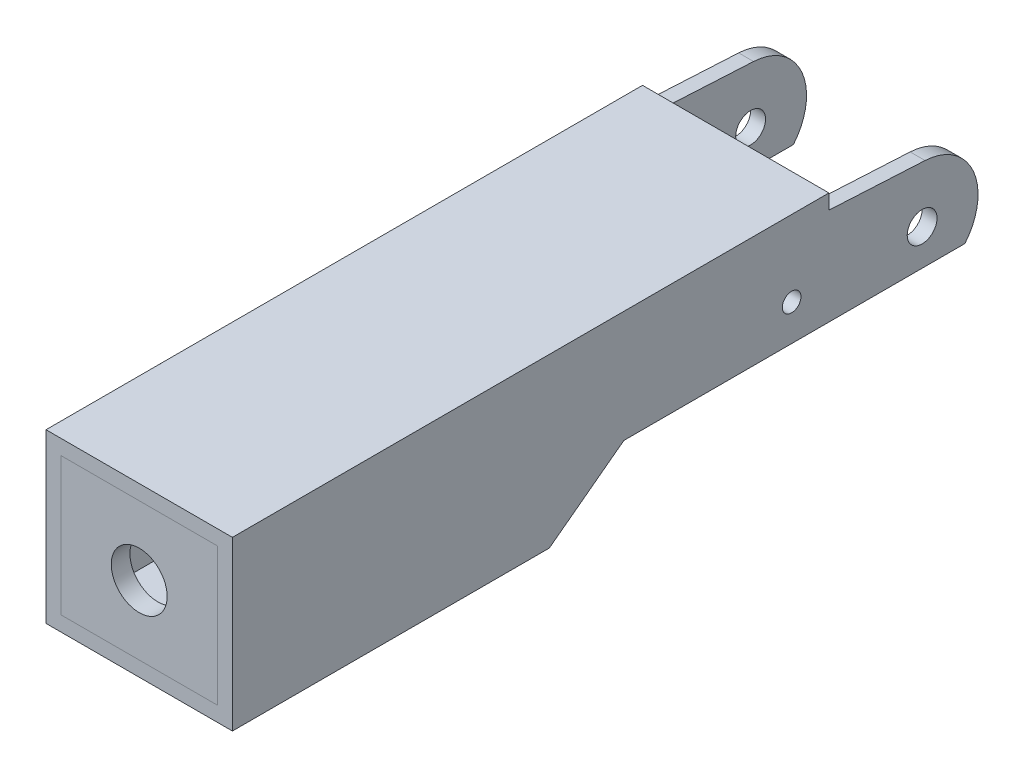
ISO-10303-21;
HEADER;
FILE_DESCRIPTION(('STEP AP214'),'2;1');
FILE_NAME('part.step','',(''),(''),'','','');
FILE_SCHEMA(('AUTOMOTIVE_DESIGN { 1 0 10303 214 1 1 1 1 }'));
ENDSEC;
DATA;
#1=APPLICATION_CONTEXT('core data for automotive mechanical design processes');
#2=APPLICATION_PROTOCOL_DEFINITION('international standard','automotive_design',2000,#1);
#3=PRODUCT_CONTEXT('',#1,'mechanical');
#4=PRODUCT('Part','Part','',(#3));
#5=PRODUCT_RELATED_PRODUCT_CATEGORY('part','',(#4));
#6=PRODUCT_DEFINITION_FORMATION('','',#4);
#7=PRODUCT_DEFINITION_CONTEXT('part definition',#1,'design');
#8=PRODUCT_DEFINITION('design','',#6,#7);
#9=PRODUCT_DEFINITION_SHAPE('','',#8);
#10=(LENGTH_UNIT() NAMED_UNIT(*) SI_UNIT(.MILLI.,.METRE.));
#11=(NAMED_UNIT(*) PLANE_ANGLE_UNIT() SI_UNIT($,.RADIAN.));
#12=(NAMED_UNIT(*) SI_UNIT($,.STERADIAN.) SOLID_ANGLE_UNIT());
#13=UNCERTAINTY_MEASURE_WITH_UNIT(LENGTH_MEASURE(1.E-05),#10,'distance_accuracy_value','');
#14=(GEOMETRIC_REPRESENTATION_CONTEXT(3) GLOBAL_UNCERTAINTY_ASSIGNED_CONTEXT((#13)) GLOBAL_UNIT_ASSIGNED_CONTEXT((#10,
#11,#12)) REPRESENTATION_CONTEXT('',''));
#15=CARTESIAN_POINT('',(0.,0.,0.));
#16=DIRECTION('',(0.,0.,1.));
#17=DIRECTION('',(1.,0.,0.));
#18=AXIS2_PLACEMENT_3D('',#15,#16,#17);
#19=CARTESIAN_POINT('',(4.,-4.,195.));
#20=DIRECTION('',(-1.,0.,0.));
#21=DIRECTION('',(0.,0.,1.));
#22=AXIS2_PLACEMENT_3D('',#19,#20,#21);
#23=PLANE('',#22);
#24=DIRECTION('',(0.,-1.,0.));
#25=VECTOR('',#24,1.);
#26=CARTESIAN_POINT('',(4.,-4.,200.));
#27=LINE('',#26,#25);
#28=CARTESIAN_POINT('',(4.,-4.,200.));
#29=VERTEX_POINT('',#28);
#30=CARTESIAN_POINT('',(4.,-41.,200.));
#31=VERTEX_POINT('',#30);
#32=EDGE_CURVE('E113',#29,#31,#27,.T.);
#33=ORIENTED_EDGE('',*,*,#32,.F.);
#34=DIRECTION('',(0.,0.,1.));
#35=VECTOR('',#34,1.);
#36=CARTESIAN_POINT('',(4.,-4.,195.));
#37=LINE('',#36,#35);
#38=CARTESIAN_POINT('',(4.,-4.,195.));
#39=VERTEX_POINT('',#38);
#40=EDGE_CURVE('E13',#39,#29,#37,.T.);
#41=ORIENTED_EDGE('',*,*,#40,.F.);
#42=DIRECTION('',(0.,-1.,0.));
#43=VECTOR('',#42,1.);
#44=CARTESIAN_POINT('',(4.,-4.,195.));
#45=LINE('',#44,#43);
#46=CARTESIAN_POINT('',(4.,-41.,195.));
#47=VERTEX_POINT('',#46);
#48=EDGE_CURVE('E106',#39,#47,#45,.T.);
#49=ORIENTED_EDGE('',*,*,#48,.T.);
#50=DIRECTION('',(0.,0.,1.));
#51=VECTOR('',#50,1.);
#52=CARTESIAN_POINT('',(4.,-41.,195.));
#53=LINE('',#52,#51);
#54=EDGE_CURVE('E51',#47,#31,#53,.T.);
#55=ORIENTED_EDGE('',*,*,#54,.T.);
#56=EDGE_LOOP('',(#33,#41,#49,#55));
#57=FACE_BOUND('',#56,.T.);
#58=ADVANCED_FACE('F48',(#57),#23,.T.);
#59=CARTESIAN_POINT('',(4.,-4.,195.));
#60=DIRECTION('',(0.,1.,0.));
#61=DIRECTION('',(0.,0.,1.));
#62=AXIS2_PLACEMENT_3D('',#59,#60,#61);
#63=PLANE('',#62);
#64=DIRECTION('',(-1.,0.,0.));
#65=VECTOR('',#64,1.);
#66=CARTESIAN_POINT('',(4.,-4.,200.));
#67=LINE('',#66,#65);
#68=CARTESIAN_POINT('',(46.,-4.,200.));
#69=VERTEX_POINT('',#68);
#70=EDGE_CURVE('E108',#69,#29,#67,.T.);
#71=ORIENTED_EDGE('',*,*,#70,.F.);
#72=DIRECTION('',(0.,0.,1.));
#73=VECTOR('',#72,1.);
#74=CARTESIAN_POINT('',(46.,-4.,195.));
#75=LINE('',#74,#73);
#76=CARTESIAN_POINT('',(46.,-4.,195.));
#77=VERTEX_POINT('',#76);
#78=EDGE_CURVE('E57',#77,#69,#75,.T.);
#79=ORIENTED_EDGE('',*,*,#78,.F.);
#80=DIRECTION('',(-1.,0.,0.));
#81=VECTOR('',#80,1.);
#82=CARTESIAN_POINT('',(4.,-4.,195.));
#83=LINE('',#82,#81);
#84=EDGE_CURVE('E103',#77,#39,#83,.T.);
#85=ORIENTED_EDGE('',*,*,#84,.T.);
#86=ORIENTED_EDGE('',*,*,#40,.T.);
#87=EDGE_LOOP('',(#71,#79,#85,#86));
#88=FACE_BOUND('',#87,.T.);
#89=ADVANCED_FACE('F124',(#88),#63,.T.);
#90=CARTESIAN_POINT('',(46.,-4.,195.));
#91=DIRECTION('',(1.,0.,0.));
#92=DIRECTION('',(0.,0.,-1.));
#93=AXIS2_PLACEMENT_3D('',#90,#91,#92);
#94=PLANE('',#93);
#95=DIRECTION('',(0.,1.,0.));
#96=VECTOR('',#95,1.);
#97=CARTESIAN_POINT('',(46.,-4.,200.));
#98=LINE('',#97,#96);
#99=CARTESIAN_POINT('',(46.,-41.,200.));
#100=VERTEX_POINT('',#99);
#101=EDGE_CURVE('E98',#100,#69,#98,.T.);
#102=ORIENTED_EDGE('',*,*,#101,.F.);
#103=DIRECTION('',(0.,0.,1.));
#104=VECTOR('',#103,1.);
#105=CARTESIAN_POINT('',(46.,-41.,195.));
#106=LINE('',#105,#104);
#107=CARTESIAN_POINT('',(46.,-41.,195.));
#108=VERTEX_POINT('',#107);
#109=EDGE_CURVE('E93',#108,#100,#106,.T.);
#110=ORIENTED_EDGE('',*,*,#109,.F.);
#111=DIRECTION('',(0.,1.,0.));
#112=VECTOR('',#111,1.);
#113=CARTESIAN_POINT('',(46.,-4.,195.));
#114=LINE('',#113,#112);
#115=EDGE_CURVE('E96',#108,#77,#114,.T.);
#116=ORIENTED_EDGE('',*,*,#115,.T.);
#117=ORIENTED_EDGE('',*,*,#78,.T.);
#118=EDGE_LOOP('',(#102,#110,#116,#117));
#119=FACE_BOUND('',#118,.T.);
#120=ADVANCED_FACE('F95',(#119),#94,.T.);
#121=CARTESIAN_POINT('',(4.,-41.,195.));
#122=DIRECTION('',(0.,-1.,0.));
#123=DIRECTION('',(0.,0.,-1.));
#124=AXIS2_PLACEMENT_3D('',#121,#122,#123);
#125=PLANE('',#124);
#126=DIRECTION('',(1.,0.,0.));
#127=VECTOR('',#126,1.);
#128=CARTESIAN_POINT('',(4.,-41.,200.));
#129=LINE('',#128,#127);
#130=EDGE_CURVE('E116',#31,#100,#129,.T.);
#131=ORIENTED_EDGE('',*,*,#130,.F.);
#132=ORIENTED_EDGE('',*,*,#54,.F.);
#133=DIRECTION('',(1.,0.,0.));
#134=VECTOR('',#133,1.);
#135=CARTESIAN_POINT('',(4.,-41.,195.));
#136=LINE('',#135,#134);
#137=EDGE_CURVE('E102',#47,#108,#136,.T.);
#138=ORIENTED_EDGE('',*,*,#137,.T.);
#139=ORIENTED_EDGE('',*,*,#109,.T.);
#140=EDGE_LOOP('',(#131,#132,#138,#139));
#141=FACE_BOUND('',#140,.T.);
#142=ADVANCED_FACE('F105',(#141),#125,.T.);
#143=CARTESIAN_POINT('',(0.,0.,195.));
#144=DIRECTION('',(0.,0.,1.));
#145=DIRECTION('',(1.,0.,0.));
#146=AXIS2_PLACEMENT_3D('',#143,#144,#145);
#147=PLANE('',#146);
#148=CARTESIAN_POINT('',(25.,-22.5,195.));
#149=DIRECTION('',(0.,0.,1.));
#150=DIRECTION('',(1.,0.,0.));
#151=AXIS2_PLACEMENT_3D('',#148,#149,#150);
#152=CIRCLE('',#151,7.5);
#153=CARTESIAN_POINT('',(32.5,-22.5,195.));
#154=VERTEX_POINT('',#153);
#155=EDGE_CURVE('E117',#154,#154,#152,.T.);
#156=ORIENTED_EDGE('',*,*,#155,.T.);
#157=EDGE_LOOP('',(#156));
#158=FACE_BOUND('',#157,.T.);
#159=ORIENTED_EDGE('',*,*,#48,.F.);
#160=ORIENTED_EDGE('',*,*,#84,.F.);
#161=ORIENTED_EDGE('',*,*,#115,.F.);
#162=ORIENTED_EDGE('',*,*,#137,.F.);
#163=EDGE_LOOP('',(#159,#160,#161,#162));
#164=FACE_BOUND('',#163,.T.);
#165=ADVANCED_FACE('F101',(#158,#164),#147,.F.);
#166=CARTESIAN_POINT('',(0.,0.,200.));
#167=DIRECTION('',(0.,0.,1.));
#168=DIRECTION('',(1.,0.,0.));
#169=AXIS2_PLACEMENT_3D('',#166,#167,#168);
#170=PLANE('',#169);
#171=CARTESIAN_POINT('',(25.,-22.5,200.));
#172=DIRECTION('',(0.,0.,1.));
#173=DIRECTION('',(1.,0.,0.));
#174=AXIS2_PLACEMENT_3D('',#171,#172,#173);
#175=CIRCLE('',#174,7.5);
#176=CARTESIAN_POINT('',(32.5,-22.5,200.));
#177=VERTEX_POINT('',#176);
#178=EDGE_CURVE('E154',#177,#177,#175,.T.);
#179=ORIENTED_EDGE('',*,*,#178,.F.);
#180=EDGE_LOOP('',(#179));
#181=FACE_BOUND('',#180,.T.);
#182=ORIENTED_EDGE('',*,*,#32,.T.);
#183=ORIENTED_EDGE('',*,*,#130,.T.);
#184=ORIENTED_EDGE('',*,*,#101,.T.);
#185=ORIENTED_EDGE('',*,*,#70,.T.);
#186=EDGE_LOOP('',(#182,#183,#184,#185));
#187=FACE_BOUND('',#186,.T.);
#188=ADVANCED_FACE('F123',(#181,#187),#170,.T.);
#189=CARTESIAN_POINT('',(25.,-22.5,195.));
#190=DIRECTION('',(0.,0.,1.));
#191=DIRECTION('',(1.,0.,0.));
#192=AXIS2_PLACEMENT_3D('',#189,#190,#191);
#193=CYLINDRICAL_SURFACE('',#192,7.5);
#194=ORIENTED_EDGE('',*,*,#155,.F.);
#195=EDGE_LOOP('',(#194));
#196=FACE_BOUND('',#195,.T.);
#197=ORIENTED_EDGE('',*,*,#178,.T.);
#198=EDGE_LOOP('',(#197));
#199=FACE_BOUND('',#198,.T.);
#200=ADVANCED_FACE('F142',(#196,#199),#193,.F.);
#201=CLOSED_SHELL('',(#58,#89,#120,#142,#165,#188,#200));
#202=MANIFOLD_SOLID_BREP('B2',#201);
#203=CARTESIAN_POINT('',(0.,0.,200.));
#204=DIRECTION('',(1.,0.,0.));
#205=DIRECTION('',(0.,1.,0.));
#206=AXIS2_PLACEMENT_3D('',#203,#204,#205);
#207=PLANE('',#206);
#208=CARTESIAN_POINT('',(0.,-20.3419669683545,15.));
#209=DIRECTION('',(1.,0.,0.));
#210=DIRECTION('',(0.,1.,0.));
#211=AXIS2_PLACEMENT_3D('',#208,#209,#210);
#212=CIRCLE('',#211,4.);
#213=CARTESIAN_POINT('',(0.,-16.3419669683545,15.));
#214=VERTEX_POINT('',#213);
#215=EDGE_CURVE('E333',#214,#214,#212,.T.);
#216=ORIENTED_EDGE('',*,*,#215,.T.);
#217=EDGE_LOOP('',(#216));
#218=FACE_BOUND('',#217,.T.);
#219=CARTESIAN_POINT('',(0.,-20.3419669683545,50.));
#220=DIRECTION('',(1.,0.,0.));
#221=DIRECTION('',(0.,1.,0.));
#222=AXIS2_PLACEMENT_3D('',#219,#220,#221);
#223=CIRCLE('',#222,2.5);
#224=CARTESIAN_POINT('',(0.,-17.8419669683545,50.));
#225=VERTEX_POINT('',#224);
#226=EDGE_CURVE('E354',#225,#225,#223,.T.);
#227=ORIENTED_EDGE('',*,*,#226,.T.);
#228=EDGE_LOOP('',(#227));
#229=FACE_BOUND('',#228,.T.);
#230=DIRECTION('',(0.,1.,0.));
#231=VECTOR('',#230,1.);
#232=CARTESIAN_POINT('',(0.,-4.00000000000001,40.));
#233=LINE('',#232,#231);
#234=CARTESIAN_POINT('',(0.,-4.00000000000001,40.));
#235=VERTEX_POINT('',#234);
#236=CARTESIAN_POINT('',(0.,0.,40.));
#237=VERTEX_POINT('',#236);
#238=EDGE_CURVE('E222',#235,#237,#233,.T.);
#239=ORIENTED_EDGE('',*,*,#238,.F.);
#240=DIRECTION('',(0.,0.0527679735850537,0.998606799978714));
#241=VECTOR('',#240,1.);
#242=CARTESIAN_POINT('',(0.,-5.36286496867381,14.2084803962242));
#243=LINE('',#242,#241);
#244=CARTESIAN_POINT('',(0.,-5.36286496867381,14.2084803962242));
#245=VERTEX_POINT('',#244);
#246=EDGE_CURVE('E322',#245,#235,#243,.T.);
#247=ORIENTED_EDGE('',*,*,#246,.F.);
#248=CARTESIAN_POINT('',(0.,-20.3419669683545,15.));
#249=DIRECTION('',(1.,0.,0.));
#250=DIRECTION('',(0.,-1.,0.));
#251=AXIS2_PLACEMENT_3D('',#248,#249,#250);
#252=CIRCLE('',#251,15.);
#253=CARTESIAN_POINT('',(0.,-30.,3.52296214349518));
#254=VERTEX_POINT('',#253);
#255=EDGE_CURVE('E395',#254,#245,#252,.T.);
#256=ORIENTED_EDGE('',*,*,#255,.F.);
#257=DIRECTION('',(0.,0.,-1.));
#258=VECTOR('',#257,1.);
#259=CARTESIAN_POINT('',(0.,-30.,3.52296214349518));
#260=LINE('',#259,#258);
#261=CARTESIAN_POINT('',(0.,-30.,95.));
#262=VERTEX_POINT('',#261);
#263=EDGE_CURVE('E397',#262,#254,#260,.T.);
#264=ORIENTED_EDGE('',*,*,#263,.F.);
#265=DIRECTION('',(0.,0.6,-0.8));
#266=VECTOR('',#265,1.);
#267=CARTESIAN_POINT('',(0.,-30.,95.));
#268=LINE('',#267,#266);
#269=CARTESIAN_POINT('',(0.,-45.,115.));
#270=VERTEX_POINT('',#269);
#271=EDGE_CURVE('E400',#270,#262,#268,.T.);
#272=ORIENTED_EDGE('',*,*,#271,.F.);
#273=DIRECTION('',(0.,0.,-1.));
#274=VECTOR('',#273,1.);
#275=CARTESIAN_POINT('',(0.,-45.,200.));
#276=LINE('',#275,#274);
#277=CARTESIAN_POINT('',(0.,-45.,200.));
#278=VERTEX_POINT('',#277);
#279=EDGE_CURVE('E342',#278,#270,#276,.T.);
#280=ORIENTED_EDGE('',*,*,#279,.F.);
#281=DIRECTION('',(0.,-1.,0.));
#282=VECTOR('',#281,1.);
#283=CARTESIAN_POINT('',(0.,0.,200.));
#284=LINE('',#283,#282);
#285=CARTESIAN_POINT('',(0.,0.,200.));
#286=VERTEX_POINT('',#285);
#287=EDGE_CURVE('E451',#286,#278,#284,.T.);
#288=ORIENTED_EDGE('',*,*,#287,.F.);
#289=DIRECTION('',(0.,0.,-1.));
#290=VECTOR('',#289,1.);
#291=CARTESIAN_POINT('',(0.,0.,200.));
#292=LINE('',#291,#290);
#293=EDGE_CURVE('E339',#286,#237,#292,.T.);
#294=ORIENTED_EDGE('',*,*,#293,.T.);
#295=EDGE_LOOP('',(#239,#247,#256,#264,#272,#280,#288,#294));
#296=FACE_BOUND('',#295,.T.);
#297=ADVANCED_FACE('F207',(#218,#229,#296),#207,.F.);
#298=CARTESIAN_POINT('',(0.,-45.,200.));
#299=DIRECTION('',(0.,1.,0.));
#300=DIRECTION('',(0.,0.,1.));
#301=AXIS2_PLACEMENT_3D('',#298,#299,#300);
#302=PLANE('',#301);
#303=DIRECTION('',(1.,0.,0.));
#304=VECTOR('',#303,1.);
#305=CARTESIAN_POINT('',(0.,-45.,115.));
#306=LINE('',#305,#304);
#307=CARTESIAN_POINT('',(50.,-45.,115.));
#308=VERTEX_POINT('',#307);
#309=EDGE_CURVE('E323',#270,#308,#306,.T.);
#310=ORIENTED_EDGE('',*,*,#309,.T.);
#311=DIRECTION('',(0.,0.,-1.));
#312=VECTOR('',#311,1.);
#313=CARTESIAN_POINT('',(50.,-45.,200.));
#314=LINE('',#313,#312);
#315=CARTESIAN_POINT('',(50.,-45.,200.));
#316=VERTEX_POINT('',#315);
#317=EDGE_CURVE('E338',#316,#308,#314,.T.);
#318=ORIENTED_EDGE('',*,*,#317,.F.);
#319=DIRECTION('',(1.,0.,0.));
#320=VECTOR('',#319,1.);
#321=CARTESIAN_POINT('',(0.,-45.,200.));
#322=LINE('',#321,#320);
#323=EDGE_CURVE('E454',#278,#316,#322,.T.);
#324=ORIENTED_EDGE('',*,*,#323,.F.);
#325=ORIENTED_EDGE('',*,*,#279,.T.);
#326=EDGE_LOOP('',(#310,#318,#324,#325));
#327=FACE_BOUND('',#326,.T.);
#328=ADVANCED_FACE('F467',(#327),#302,.F.);
#329=CARTESIAN_POINT('',(50.,0.,200.));
#330=DIRECTION('',(-1.,0.,0.));
#331=DIRECTION('',(0.,-1.,0.));
#332=AXIS2_PLACEMENT_3D('',#329,#330,#331);
#333=PLANE('',#332);
#334=CARTESIAN_POINT('',(50.,-20.3419669683545,15.));
#335=DIRECTION('',(1.,0.,0.));
#336=DIRECTION('',(0.,1.,0.));
#337=AXIS2_PLACEMENT_3D('',#334,#335,#336);
#338=CIRCLE('',#337,4.);
#339=CARTESIAN_POINT('',(50.,-16.3419669683545,15.));
#340=VERTEX_POINT('',#339);
#341=EDGE_CURVE('E404',#340,#340,#338,.T.);
#342=ORIENTED_EDGE('',*,*,#341,.F.);
#343=EDGE_LOOP('',(#342));
#344=FACE_BOUND('',#343,.T.);
#345=CARTESIAN_POINT('',(50.,-20.3419669683545,50.));
#346=DIRECTION('',(1.,0.,0.));
#347=DIRECTION('',(0.,1.,0.));
#348=AXIS2_PLACEMENT_3D('',#345,#346,#347);
#349=CIRCLE('',#348,2.5);
#350=CARTESIAN_POINT('',(50.,-17.8419669683545,50.));
#351=VERTEX_POINT('',#350);
#352=EDGE_CURVE('E407',#351,#351,#349,.T.);
#353=ORIENTED_EDGE('',*,*,#352,.F.);
#354=EDGE_LOOP('',(#353));
#355=FACE_BOUND('',#354,.T.);
#356=DIRECTION('',(0.,1.,0.));
#357=VECTOR('',#356,1.);
#358=CARTESIAN_POINT('',(50.,-4.,40.));
#359=LINE('',#358,#357);
#360=CARTESIAN_POINT('',(50.,-4.,40.));
#361=VERTEX_POINT('',#360);
#362=CARTESIAN_POINT('',(50.,0.,40.));
#363=VERTEX_POINT('',#362);
#364=EDGE_CURVE('E316',#361,#363,#359,.T.);
#365=ORIENTED_EDGE('',*,*,#364,.T.);
#366=DIRECTION('',(0.,0.,-1.));
#367=VECTOR('',#366,1.);
#368=CARTESIAN_POINT('',(50.,0.,200.));
#369=LINE('',#368,#367);
#370=CARTESIAN_POINT('',(50.,0.,200.));
#371=VERTEX_POINT('',#370);
#372=EDGE_CURVE('E329',#371,#363,#369,.T.);
#373=ORIENTED_EDGE('',*,*,#372,.F.);
#374=DIRECTION('',(0.,1.,0.));
#375=VECTOR('',#374,1.);
#376=CARTESIAN_POINT('',(50.,0.,200.));
#377=LINE('',#376,#375);
#378=EDGE_CURVE('E456',#316,#371,#377,.T.);
#379=ORIENTED_EDGE('',*,*,#378,.F.);
#380=ORIENTED_EDGE('',*,*,#317,.T.);
#381=DIRECTION('',(0.,0.6,-0.8));
#382=VECTOR('',#381,1.);
#383=CARTESIAN_POINT('',(50.,-30.,95.));
#384=LINE('',#383,#382);
#385=CARTESIAN_POINT('',(50.,-30.,95.));
#386=VERTEX_POINT('',#385);
#387=EDGE_CURVE('E334',#308,#386,#384,.T.);
#388=ORIENTED_EDGE('',*,*,#387,.T.);
#389=DIRECTION('',(0.,0.,-1.));
#390=VECTOR('',#389,1.);
#391=CARTESIAN_POINT('',(50.,-30.,3.52296214349518));
#392=LINE('',#391,#390);
#393=CARTESIAN_POINT('',(50.,-30.,3.52296214349518));
#394=VERTEX_POINT('',#393);
#395=EDGE_CURVE('E388',#386,#394,#392,.T.);
#396=ORIENTED_EDGE('',*,*,#395,.T.);
#397=CARTESIAN_POINT('',(50.,-20.3419669683545,15.));
#398=DIRECTION('',(1.,0.,0.));
#399=DIRECTION('',(0.,-1.,0.));
#400=AXIS2_PLACEMENT_3D('',#397,#398,#399);
#401=CIRCLE('',#400,15.);
#402=CARTESIAN_POINT('',(50.,-5.3628649686738,14.2084803962242));
#403=VERTEX_POINT('',#402);
#404=EDGE_CURVE('E386',#394,#403,#401,.T.);
#405=ORIENTED_EDGE('',*,*,#404,.T.);
#406=DIRECTION('',(0.,0.0527679735850537,0.998606799978714));
#407=VECTOR('',#406,1.);
#408=CARTESIAN_POINT('',(50.,-5.3628649686738,14.2084803962242));
#409=LINE('',#408,#407);
#410=EDGE_CURVE('E332',#403,#361,#409,.T.);
#411=ORIENTED_EDGE('',*,*,#410,.T.);
#412=EDGE_LOOP('',(#365,#373,#379,#380,#388,#396,#405,#411));
#413=FACE_BOUND('',#412,.T.);
#414=ADVANCED_FACE('F327',(#344,#355,#413),#333,.F.);
#415=CARTESIAN_POINT('',(0.,0.,200.));
#416=DIRECTION('',(0.,-1.,0.));
#417=DIRECTION('',(0.,0.,-1.));
#418=AXIS2_PLACEMENT_3D('',#415,#416,#417);
#419=PLANE('',#418);
#420=DIRECTION('',(1.,0.,0.));
#421=VECTOR('',#420,1.);
#422=CARTESIAN_POINT('',(0.,0.,40.));
#423=LINE('',#422,#421);
#424=EDGE_CURVE('E312',#237,#363,#423,.T.);
#425=ORIENTED_EDGE('',*,*,#424,.F.);
#426=ORIENTED_EDGE('',*,*,#293,.F.);
#427=DIRECTION('',(-1.,0.,0.));
#428=VECTOR('',#427,1.);
#429=CARTESIAN_POINT('',(0.,0.,200.));
#430=LINE('',#429,#428);
#431=EDGE_CURVE('E337',#371,#286,#430,.T.);
#432=ORIENTED_EDGE('',*,*,#431,.F.);
#433=ORIENTED_EDGE('',*,*,#372,.T.);
#434=EDGE_LOOP('',(#425,#426,#432,#433));
#435=FACE_BOUND('',#434,.T.);
#436=ADVANCED_FACE('F336',(#435),#419,.F.);
#437=CARTESIAN_POINT('',(4.,-4.,200.));
#438=DIRECTION('',(0.,-1.,0.));
#439=DIRECTION('',(0.,0.,-1.));
#440=AXIS2_PLACEMENT_3D('',#437,#438,#439);
#441=PLANE('',#440);
#442=DIRECTION('',(0.,0.,-1.));
#443=VECTOR('',#442,1.);
#444=CARTESIAN_POINT('',(4.,-4.,200.));
#445=LINE('',#444,#443);
#446=CARTESIAN_POINT('',(4.,-4.,200.));
#447=VERTEX_POINT('',#446);
#448=CARTESIAN_POINT('',(4.,-4.00000000000001,40.));
#449=VERTEX_POINT('',#448);
#450=EDGE_CURVE('E448',#447,#449,#445,.T.);
#451=ORIENTED_EDGE('',*,*,#450,.T.);
#452=DIRECTION('',(1.,0.,0.));
#453=VECTOR('',#452,1.);
#454=CARTESIAN_POINT('',(0.,-4.00000000000001,40.));
#455=LINE('',#454,#453);
#456=CARTESIAN_POINT('',(46.,-4.,40.));
#457=VERTEX_POINT('',#456);
#458=EDGE_CURVE('E378',#449,#457,#455,.T.);
#459=ORIENTED_EDGE('',*,*,#458,.T.);
#460=DIRECTION('',(0.,0.,-1.));
#461=VECTOR('',#460,1.);
#462=CARTESIAN_POINT('',(46.,-4.,200.));
#463=LINE('',#462,#461);
#464=CARTESIAN_POINT('',(46.,-4.,200.));
#465=VERTEX_POINT('',#464);
#466=EDGE_CURVE('E440',#465,#457,#463,.T.);
#467=ORIENTED_EDGE('',*,*,#466,.F.);
#468=DIRECTION('',(-1.,0.,0.));
#469=VECTOR('',#468,1.);
#470=CARTESIAN_POINT('',(4.,-4.,200.));
#471=LINE('',#470,#469);
#472=EDGE_CURVE('E431',#465,#447,#471,.T.);
#473=ORIENTED_EDGE('',*,*,#472,.T.);
#474=EDGE_LOOP('',(#451,#459,#467,#473));
#475=FACE_BOUND('',#474,.T.);
#476=ADVANCED_FACE('F494',(#475),#441,.T.);
#477=CARTESIAN_POINT('',(4.,-4.,200.));
#478=DIRECTION('',(1.,0.,0.));
#479=DIRECTION('',(0.,0.,-1.));
#480=AXIS2_PLACEMENT_3D('',#477,#478,#479);
#481=PLANE('',#480);
#482=CARTESIAN_POINT('',(4.,-20.3419669683545,15.));
#483=DIRECTION('',(1.,0.,0.));
#484=DIRECTION('',(0.,0.,-1.));
#485=AXIS2_PLACEMENT_3D('',#482,#483,#484);
#486=CIRCLE('',#485,4.);
#487=CARTESIAN_POINT('',(4.,-20.3419669683545,11.));
#488=VERTEX_POINT('',#487);
#489=EDGE_CURVE('E428',#488,#488,#486,.T.);
#490=ORIENTED_EDGE('',*,*,#489,.F.);
#491=EDGE_LOOP('',(#490));
#492=FACE_BOUND('',#491,.T.);
#493=CARTESIAN_POINT('',(4.,-20.3419669683545,50.));
#494=DIRECTION('',(1.,0.,0.));
#495=DIRECTION('',(0.,0.,-1.));
#496=AXIS2_PLACEMENT_3D('',#493,#494,#495);
#497=CIRCLE('',#496,2.5);
#498=CARTESIAN_POINT('',(4.,-20.3419669683545,47.5));
#499=VERTEX_POINT('',#498);
#500=EDGE_CURVE('E353',#499,#499,#497,.T.);
#501=ORIENTED_EDGE('',*,*,#500,.F.);
#502=EDGE_LOOP('',(#501));
#503=FACE_BOUND('',#502,.T.);
#504=CARTESIAN_POINT('',(4.,-20.3419669683545,15.));
#505=DIRECTION('',(1.,0.,0.));
#506=DIRECTION('',(0.,0.,-1.));
#507=AXIS2_PLACEMENT_3D('',#504,#505,#506);
#508=CIRCLE('',#507,15.);
#509=CARTESIAN_POINT('',(4.,-30.,3.52296214349518));
#510=VERTEX_POINT('',#509);
#511=CARTESIAN_POINT('',(4.,-5.36286496867381,14.2084803962242));
#512=VERTEX_POINT('',#511);
#513=EDGE_CURVE('E423',#510,#512,#508,.T.);
#514=ORIENTED_EDGE('',*,*,#513,.T.);
#515=DIRECTION('',(0.,0.0527679735850537,0.998606799978714));
#516=VECTOR('',#515,1.);
#517=CARTESIAN_POINT('',(4.,4.43111315890108,199.554486554196));
#518=LINE('',#517,#516);
#519=EDGE_CURVE('E425',#512,#449,#518,.T.);
#520=ORIENTED_EDGE('',*,*,#519,.T.);
#521=ORIENTED_EDGE('',*,*,#450,.F.);
#522=DIRECTION('',(0.,-1.,0.));
#523=VECTOR('',#522,1.);
#524=CARTESIAN_POINT('',(4.,-4.,200.));
#525=LINE('',#524,#523);
#526=CARTESIAN_POINT('',(4.,-41.,200.));
#527=VERTEX_POINT('',#526);
#528=EDGE_CURVE('E433',#447,#527,#525,.T.);
#529=ORIENTED_EDGE('',*,*,#528,.T.);
#530=DIRECTION('',(0.,0.,-1.));
#531=VECTOR('',#530,1.);
#532=CARTESIAN_POINT('',(4.,-41.,200.));
#533=LINE('',#532,#531);
#534=CARTESIAN_POINT('',(4.,-41.,109.666666666667));
#535=VERTEX_POINT('',#534);
#536=EDGE_CURVE('E445',#527,#535,#533,.T.);
#537=ORIENTED_EDGE('',*,*,#536,.T.);
#538=DIRECTION('',(0.,0.6,-0.8));
#539=VECTOR('',#538,1.);
#540=CARTESIAN_POINT('',(4.,-71.04,149.72));
#541=LINE('',#540,#539);
#542=CARTESIAN_POINT('',(4.,-30.,95.));
#543=VERTEX_POINT('',#542);
#544=EDGE_CURVE('E417',#535,#543,#541,.T.);
#545=ORIENTED_EDGE('',*,*,#544,.T.);
#546=DIRECTION('',(0.,0.,-1.));
#547=VECTOR('',#546,1.);
#548=CARTESIAN_POINT('',(4.,-30.,200.));
#549=LINE('',#548,#547);
#550=EDGE_CURVE('E420',#543,#510,#549,.T.);
#551=ORIENTED_EDGE('',*,*,#550,.T.);
#552=EDGE_LOOP('',(#514,#520,#521,#529,#537,#545,#551));
#553=FACE_BOUND('',#552,.T.);
#554=ADVANCED_FACE('F483',(#492,#503,#553),#481,.T.);
#555=CARTESIAN_POINT('',(4.,-41.,200.));
#556=DIRECTION('',(0.,1.,0.));
#557=DIRECTION('',(0.,0.,1.));
#558=AXIS2_PLACEMENT_3D('',#555,#556,#557);
#559=PLANE('',#558);
#560=DIRECTION('',(0.,0.,-1.));
#561=VECTOR('',#560,1.);
#562=CARTESIAN_POINT('',(46.,-41.,200.));
#563=LINE('',#562,#561);
#564=CARTESIAN_POINT('',(46.,-41.,200.));
#565=VERTEX_POINT('',#564);
#566=CARTESIAN_POINT('',(46.,-41.,109.666666666667));
#567=VERTEX_POINT('',#566);
#568=EDGE_CURVE('E442',#565,#567,#563,.T.);
#569=ORIENTED_EDGE('',*,*,#568,.T.);
#570=DIRECTION('',(-1.,0.,0.));
#571=VECTOR('',#570,1.);
#572=CARTESIAN_POINT('',(4.00000000000002,-41.,109.666666666667));
#573=LINE('',#572,#571);
#574=EDGE_CURVE('E230',#567,#535,#573,.T.);
#575=ORIENTED_EDGE('',*,*,#574,.T.);
#576=ORIENTED_EDGE('',*,*,#536,.F.);
#577=DIRECTION('',(1.,0.,0.));
#578=VECTOR('',#577,1.);
#579=CARTESIAN_POINT('',(4.,-41.,200.));
#580=LINE('',#579,#578);
#581=EDGE_CURVE('E435',#527,#565,#580,.T.);
#582=ORIENTED_EDGE('',*,*,#581,.T.);
#583=EDGE_LOOP('',(#569,#575,#576,#582));
#584=FACE_BOUND('',#583,.T.);
#585=ADVANCED_FACE('F487',(#584),#559,.T.);
#586=CARTESIAN_POINT('',(46.,-4.,200.));
#587=DIRECTION('',(-1.,0.,0.));
#588=DIRECTION('',(0.,0.,1.));
#589=AXIS2_PLACEMENT_3D('',#586,#587,#588);
#590=PLANE('',#589);
#591=CARTESIAN_POINT('',(46.,-20.3419669683545,15.));
#592=DIRECTION('',(-1.,0.,0.));
#593=DIRECTION('',(0.,0.,1.));
#594=AXIS2_PLACEMENT_3D('',#591,#592,#593);
#595=CIRCLE('',#594,4.);
#596=CARTESIAN_POINT('',(46.,-20.3419669683545,19.));
#597=VERTEX_POINT('',#596);
#598=EDGE_CURVE('E210',#597,#597,#595,.T.);
#599=ORIENTED_EDGE('',*,*,#598,.F.);
#600=EDGE_LOOP('',(#599));
#601=FACE_BOUND('',#600,.T.);
#602=CARTESIAN_POINT('',(46.,-20.3419669683545,50.));
#603=DIRECTION('',(-1.,0.,0.));
#604=DIRECTION('',(0.,0.,1.));
#605=AXIS2_PLACEMENT_3D('',#602,#603,#604);
#606=CIRCLE('',#605,2.5);
#607=CARTESIAN_POINT('',(46.,-20.3419669683545,52.5));
#608=VERTEX_POINT('',#607);
#609=EDGE_CURVE('E350',#608,#608,#606,.T.);
#610=ORIENTED_EDGE('',*,*,#609,.F.);
#611=EDGE_LOOP('',(#610));
#612=FACE_BOUND('',#611,.T.);
#613=ORIENTED_EDGE('',*,*,#466,.T.);
#614=DIRECTION('',(0.,-0.0527679735850537,-0.998606799978714));
#615=VECTOR('',#614,1.);
#616=CARTESIAN_POINT('',(46.,4.43111315890108,199.554486554196));
#617=LINE('',#616,#615);
#618=CARTESIAN_POINT('',(46.,-5.36286496867381,14.2084803962242));
#619=VERTEX_POINT('',#618);
#620=EDGE_CURVE('E46',#457,#619,#617,.T.);
#621=ORIENTED_EDGE('',*,*,#620,.T.);
#622=CARTESIAN_POINT('',(46.,-20.3419669683545,15.));
#623=DIRECTION('',(-1.,0.,0.));
#624=DIRECTION('',(0.,0.,1.));
#625=AXIS2_PLACEMENT_3D('',#622,#623,#624);
#626=CIRCLE('',#625,15.);
#627=CARTESIAN_POINT('',(46.,-30.,3.52296214349518));
#628=VERTEX_POINT('',#627);
#629=EDGE_CURVE('E215',#619,#628,#626,.T.);
#630=ORIENTED_EDGE('',*,*,#629,.T.);
#631=DIRECTION('',(0.,0.,1.));
#632=VECTOR('',#631,1.);
#633=CARTESIAN_POINT('',(46.,-30.,200.));
#634=LINE('',#633,#632);
#635=CARTESIAN_POINT('',(46.,-30.,95.));
#636=VERTEX_POINT('',#635);
#637=EDGE_CURVE('E356',#628,#636,#634,.T.);
#638=ORIENTED_EDGE('',*,*,#637,.T.);
#639=DIRECTION('',(0.,-0.6,0.8));
#640=VECTOR('',#639,1.);
#641=CARTESIAN_POINT('',(46.,-71.04,149.72));
#642=LINE('',#641,#640);
#643=EDGE_CURVE('E349',#636,#567,#642,.T.);
#644=ORIENTED_EDGE('',*,*,#643,.T.);
#645=ORIENTED_EDGE('',*,*,#568,.F.);
#646=DIRECTION('',(0.,1.,0.));
#647=VECTOR('',#646,1.);
#648=CARTESIAN_POINT('',(46.,-4.,200.));
#649=LINE('',#648,#647);
#650=EDGE_CURVE('E438',#565,#465,#649,.T.);
#651=ORIENTED_EDGE('',*,*,#650,.T.);
#652=EDGE_LOOP('',(#613,#621,#630,#638,#644,#645,#651));
#653=FACE_BOUND('',#652,.T.);
#654=ADVANCED_FACE('F362',(#601,#612,#653),#590,.T.);
#655=CARTESIAN_POINT('',(0.,0.,200.));
#656=DIRECTION('',(0.,0.,1.));
#657=DIRECTION('',(1.,0.,0.));
#658=AXIS2_PLACEMENT_3D('',#655,#656,#657);
#659=PLANE('',#658);
#660=ORIENTED_EDGE('',*,*,#287,.T.);
#661=ORIENTED_EDGE('',*,*,#323,.T.);
#662=ORIENTED_EDGE('',*,*,#378,.T.);
#663=ORIENTED_EDGE('',*,*,#431,.T.);
#664=EDGE_LOOP('',(#660,#661,#662,#663));
#665=FACE_BOUND('',#664,.T.);
#666=ORIENTED_EDGE('',*,*,#528,.F.);
#667=ORIENTED_EDGE('',*,*,#472,.F.);
#668=ORIENTED_EDGE('',*,*,#650,.F.);
#669=ORIENTED_EDGE('',*,*,#581,.F.);
#670=EDGE_LOOP('',(#666,#667,#668,#669));
#671=FACE_BOUND('',#670,.T.);
#672=ADVANCED_FACE('F458',(#665,#671),#659,.T.);
#673=CARTESIAN_POINT('',(0.,-20.3419669683545,50.));
#674=DIRECTION('',(1.,0.,0.));
#675=DIRECTION('',(0.,1.,0.));
#676=AXIS2_PLACEMENT_3D('',#673,#674,#675);
#677=CYLINDRICAL_SURFACE('',#676,2.5);
#678=ORIENTED_EDGE('',*,*,#609,.T.);
#679=EDGE_LOOP('',(#678));
#680=FACE_BOUND('',#679,.T.);
#681=ORIENTED_EDGE('',*,*,#352,.T.);
#682=EDGE_LOOP('',(#681));
#683=FACE_BOUND('',#682,.T.);
#684=ADVANCED_FACE('F508',(#680,#683),#677,.F.);
#685=CARTESIAN_POINT('',(0.,-5.36286496867381,14.2084803962242));
#686=DIRECTION('',(0.,0.998606799978714,-0.0527679735850537));
#687=DIRECTION('',(0.,0.0527679735850537,0.998606799978714));
#688=AXIS2_PLACEMENT_3D('',#685,#686,#687);
#689=PLANE('',#688);
#690=DIRECTION('',(1.,0.,0.));
#691=VECTOR('',#690,1.);
#692=CARTESIAN_POINT('',(0.,-5.36286496867381,14.2084803962242));
#693=LINE('',#692,#691);
#694=EDGE_CURVE('E373',#245,#512,#693,.T.);
#695=ORIENTED_EDGE('',*,*,#694,.F.);
#696=ORIENTED_EDGE('',*,*,#246,.T.);
#697=EDGE_CURVE('E374',#235,#449,#455,.T.);
#698=ORIENTED_EDGE('',*,*,#697,.T.);
#699=ORIENTED_EDGE('',*,*,#519,.F.);
#700=EDGE_LOOP('',(#695,#696,#698,#699));
#701=FACE_BOUND('',#700,.T.);
#702=ADVANCED_FACE('F499',(#701),#689,.T.);
#703=CARTESIAN_POINT('',(0.,-20.3419669683545,15.));
#704=DIRECTION('',(1.,0.,0.));
#705=DIRECTION('',(0.,1.,0.));
#706=AXIS2_PLACEMENT_3D('',#703,#704,#705);
#707=CYLINDRICAL_SURFACE('',#706,15.);
#708=ORIENTED_EDGE('',*,*,#255,.T.);
#709=ORIENTED_EDGE('',*,*,#694,.T.);
#710=ORIENTED_EDGE('',*,*,#513,.F.);
#711=DIRECTION('',(1.,0.,0.));
#712=VECTOR('',#711,1.);
#713=CARTESIAN_POINT('',(0.,-30.,3.52296214349518));
#714=LINE('',#713,#712);
#715=EDGE_CURVE('E382',#254,#510,#714,.T.);
#716=ORIENTED_EDGE('',*,*,#715,.F.);
#717=EDGE_LOOP('',(#708,#709,#710,#716));
#718=FACE_BOUND('',#717,.T.);
#719=ADVANCED_FACE('F501',(#718),#707,.T.);
#720=ORIENTED_EDGE('',*,*,#629,.F.);
#721=EDGE_CURVE('E369',#619,#403,#693,.T.);
#722=ORIENTED_EDGE('',*,*,#721,.T.);
#723=ORIENTED_EDGE('',*,*,#404,.F.);
#724=EDGE_CURVE('E370',#628,#394,#714,.T.);
#725=ORIENTED_EDGE('',*,*,#724,.F.);
#726=EDGE_LOOP('',(#720,#722,#723,#725));
#727=FACE_BOUND('',#726,.T.);
#728=ADVANCED_FACE('F367',(#727),#707,.T.);
#729=CARTESIAN_POINT('',(0.,-30.,3.52296214349518));
#730=DIRECTION('',(0.,-1.,0.));
#731=DIRECTION('',(1.,0.,0.));
#732=AXIS2_PLACEMENT_3D('',#729,#730,#731);
#733=PLANE('',#732);
#734=DIRECTION('',(1.,0.,0.));
#735=VECTOR('',#734,1.);
#736=CARTESIAN_POINT('',(0.,-30.,95.));
#737=LINE('',#736,#735);
#738=EDGE_CURVE('E474',#262,#543,#737,.T.);
#739=ORIENTED_EDGE('',*,*,#738,.F.);
#740=ORIENTED_EDGE('',*,*,#263,.T.);
#741=ORIENTED_EDGE('',*,*,#715,.T.);
#742=ORIENTED_EDGE('',*,*,#550,.F.);
#743=EDGE_LOOP('',(#739,#740,#741,#742));
#744=FACE_BOUND('',#743,.T.);
#745=ADVANCED_FACE('F478',(#744),#733,.T.);
#746=CARTESIAN_POINT('',(0.,-4.00000000000001,40.));
#747=DIRECTION('',(0.,0.,-1.));
#748=DIRECTION('',(-1.,0.,0.));
#749=AXIS2_PLACEMENT_3D('',#746,#747,#748);
#750=PLANE('',#749);
#751=ORIENTED_EDGE('',*,*,#364,.F.);
#752=EDGE_CURVE('E380',#457,#361,#455,.T.);
#753=ORIENTED_EDGE('',*,*,#752,.F.);
#754=ORIENTED_EDGE('',*,*,#458,.F.);
#755=ORIENTED_EDGE('',*,*,#697,.F.);
#756=ORIENTED_EDGE('',*,*,#238,.T.);
#757=ORIENTED_EDGE('',*,*,#424,.T.);
#758=EDGE_LOOP('',(#751,#753,#754,#755,#756,#757));
#759=FACE_BOUND('',#758,.T.);
#760=ADVANCED_FACE('F314',(#759),#750,.T.);
#761=ORIENTED_EDGE('',*,*,#752,.T.);
#762=ORIENTED_EDGE('',*,*,#410,.F.);
#763=ORIENTED_EDGE('',*,*,#721,.F.);
#764=ORIENTED_EDGE('',*,*,#620,.F.);
#765=EDGE_LOOP('',(#761,#762,#763,#764));
#766=FACE_BOUND('',#765,.T.);
#767=ADVANCED_FACE('F372',(#766),#689,.T.);
#768=ORIENTED_EDGE('',*,*,#724,.T.);
#769=ORIENTED_EDGE('',*,*,#395,.F.);
#770=EDGE_CURVE('E472',#636,#386,#737,.T.);
#771=ORIENTED_EDGE('',*,*,#770,.F.);
#772=ORIENTED_EDGE('',*,*,#637,.F.);
#773=EDGE_LOOP('',(#768,#769,#771,#772));
#774=FACE_BOUND('',#773,.T.);
#775=ADVANCED_FACE('F475',(#774),#733,.T.);
#776=CARTESIAN_POINT('',(0.,-30.,95.));
#777=DIRECTION('',(0.,-0.8,-0.6));
#778=DIRECTION('',(0.,0.6,-0.8));
#779=AXIS2_PLACEMENT_3D('',#776,#777,#778);
#780=PLANE('',#779);
#781=ORIENTED_EDGE('',*,*,#574,.F.);
#782=ORIENTED_EDGE('',*,*,#643,.F.);
#783=ORIENTED_EDGE('',*,*,#770,.T.);
#784=ORIENTED_EDGE('',*,*,#387,.F.);
#785=ORIENTED_EDGE('',*,*,#309,.F.);
#786=ORIENTED_EDGE('',*,*,#271,.T.);
#787=ORIENTED_EDGE('',*,*,#738,.T.);
#788=ORIENTED_EDGE('',*,*,#544,.F.);
#789=EDGE_LOOP('',(#781,#782,#783,#784,#785,#786,#787,#788));
#790=FACE_BOUND('',#789,.T.);
#791=ADVANCED_FACE('F470',(#790),#780,.T.);
#792=CARTESIAN_POINT('',(0.,-20.3419669683545,15.));
#793=DIRECTION('',(1.,0.,0.));
#794=DIRECTION('',(0.,1.,0.));
#795=AXIS2_PLACEMENT_3D('',#792,#793,#794);
#796=CYLINDRICAL_SURFACE('',#795,4.);
#797=ORIENTED_EDGE('',*,*,#598,.T.);
#798=EDGE_LOOP('',(#797));
#799=FACE_BOUND('',#798,.T.);
#800=ORIENTED_EDGE('',*,*,#341,.T.);
#801=EDGE_LOOP('',(#800));
#802=FACE_BOUND('',#801,.T.);
#803=ADVANCED_FACE('F524',(#799,#802),#796,.F.);
#804=ORIENTED_EDGE('',*,*,#500,.T.);
#805=EDGE_LOOP('',(#804));
#806=FACE_BOUND('',#805,.T.);
#807=ORIENTED_EDGE('',*,*,#226,.F.);
#808=EDGE_LOOP('',(#807));
#809=FACE_BOUND('',#808,.T.);
#810=ADVANCED_FACE('F521',(#806,#809),#677,.F.);
#811=ORIENTED_EDGE('',*,*,#489,.T.);
#812=EDGE_LOOP('',(#811));
#813=FACE_BOUND('',#812,.T.);
#814=ORIENTED_EDGE('',*,*,#215,.F.);
#815=EDGE_LOOP('',(#814));
#816=FACE_BOUND('',#815,.T.);
#817=ADVANCED_FACE('F523',(#813,#816),#796,.F.);
#818=CLOSED_SHELL('',(#297,#328,#414,#436,#476,#554,#585,#654,#672,#684,#702,#719,#728,#745,
#760,#767,#775,#791,#803,#810,#817));
#819=MANIFOLD_SOLID_BREP('B7',#818);
#820=ADVANCED_BREP_SHAPE_REPRESENTATION('',(#18,#202,#819),#14);
#821=SHAPE_DEFINITION_REPRESENTATION(#9,#820);
ENDSEC;
END-ISO-10303-21;
